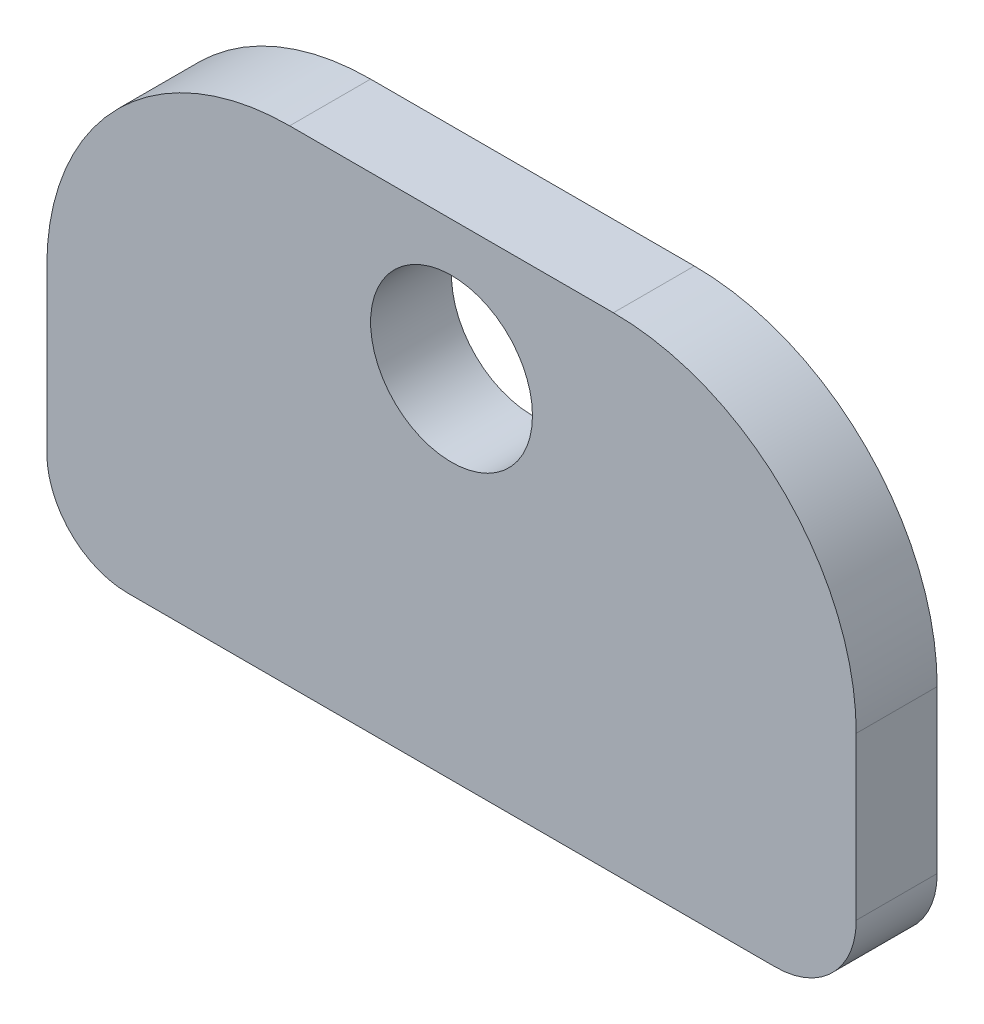
ISO-10303-21;
HEADER;
FILE_DESCRIPTION(('STEP AP214'),'2;1');
FILE_NAME('part.step','',(''),(''),'','','');
FILE_SCHEMA(('AUTOMOTIVE_DESIGN { 1 0 10303 214 1 1 1 1 }'));
ENDSEC;
DATA;
#1=APPLICATION_CONTEXT('core data for automotive mechanical design processes');
#2=APPLICATION_PROTOCOL_DEFINITION('international standard','automotive_design',2000,#1);
#3=PRODUCT_CONTEXT('',#1,'mechanical');
#4=PRODUCT('Part','Part','',(#3));
#5=PRODUCT_RELATED_PRODUCT_CATEGORY('part','',(#4));
#6=PRODUCT_DEFINITION_FORMATION('','',#4);
#7=PRODUCT_DEFINITION_CONTEXT('part definition',#1,'design');
#8=PRODUCT_DEFINITION('design','',#6,#7);
#9=PRODUCT_DEFINITION_SHAPE('','',#8);
#10=(LENGTH_UNIT() NAMED_UNIT(*) SI_UNIT(.MILLI.,.METRE.));
#11=(NAMED_UNIT(*) PLANE_ANGLE_UNIT() SI_UNIT($,.RADIAN.));
#12=(NAMED_UNIT(*) SI_UNIT($,.STERADIAN.) SOLID_ANGLE_UNIT());
#13=UNCERTAINTY_MEASURE_WITH_UNIT(LENGTH_MEASURE(1.E-05),#10,'distance_accuracy_value','');
#14=(GEOMETRIC_REPRESENTATION_CONTEXT(3) GLOBAL_UNCERTAINTY_ASSIGNED_CONTEXT((#13)) GLOBAL_UNIT_ASSIGNED_CONTEXT((#10,
#11,#12)) REPRESENTATION_CONTEXT('',''));
#15=CARTESIAN_POINT('',(0.,0.,0.));
#16=DIRECTION('',(0.,0.,1.));
#17=DIRECTION('',(1.,0.,0.));
#18=AXIS2_PLACEMENT_3D('',#15,#16,#17);
#19=CARTESIAN_POINT('',(20.,-10.,5.));
#20=DIRECTION('',(0.,0.,1.));
#21=DIRECTION('',(1.,0.,0.));
#22=AXIS2_PLACEMENT_3D('',#19,#20,#21);
#23=PLANE('',#22);
#24=CARTESIAN_POINT('',(20.,-10.,5.));
#25=DIRECTION('',(0.,0.,1.));
#26=DIRECTION('',(1.,0.,0.));
#27=AXIS2_PLACEMENT_3D('',#24,#25,#26);
#28=CIRCLE('',#27,5.);
#29=CARTESIAN_POINT('',(20.,-15.,5.));
#30=VERTEX_POINT('',#29);
#31=CARTESIAN_POINT('',(25.,-9.99999999999997,5.));
#32=VERTEX_POINT('',#31);
#33=EDGE_CURVE('E145',#30,#32,#28,.T.);
#34=ORIENTED_EDGE('',*,*,#33,.T.);
#35=DIRECTION('',(0.,1.,0.));
#36=VECTOR('',#35,1.);
#37=CARTESIAN_POINT('',(25.,-9.99999999999997,5.));
#38=LINE('',#37,#36);
#39=CARTESIAN_POINT('',(25.,-1.04744440165294E-13,5.));
#40=VERTEX_POINT('',#39);
#41=EDGE_CURVE('E93',#32,#40,#38,.T.);
#42=ORIENTED_EDGE('',*,*,#41,.T.);
#43=CARTESIAN_POINT('',(10.,0.,5.));
#44=DIRECTION('',(0.,0.,1.));
#45=DIRECTION('',(-1.,0.,0.));
#46=AXIS2_PLACEMENT_3D('',#43,#44,#45);
#47=CIRCLE('',#46,15.);
#48=CARTESIAN_POINT('',(9.9999999999999,15.,5.));
#49=VERTEX_POINT('',#48);
#50=EDGE_CURVE('E160',#40,#49,#47,.T.);
#51=ORIENTED_EDGE('',*,*,#50,.T.);
#52=DIRECTION('',(-1.,0.,0.));
#53=VECTOR('',#52,1.);
#54=CARTESIAN_POINT('',(-9.99999999999989,15.,5.));
#55=LINE('',#54,#53);
#56=CARTESIAN_POINT('',(-9.9999999999999,15.,5.));
#57=VERTEX_POINT('',#56);
#58=EDGE_CURVE('E173',#49,#57,#55,.T.);
#59=ORIENTED_EDGE('',*,*,#58,.T.);
#60=CARTESIAN_POINT('',(-10.,0.,5.));
#61=DIRECTION('',(0.,0.,1.));
#62=DIRECTION('',(-1.,0.,0.));
#63=AXIS2_PLACEMENT_3D('',#60,#61,#62);
#64=CIRCLE('',#63,15.);
#65=CARTESIAN_POINT('',(-25.,-1.07552855510562E-13,5.));
#66=VERTEX_POINT('',#65);
#67=EDGE_CURVE('E112',#57,#66,#64,.T.);
#68=ORIENTED_EDGE('',*,*,#67,.T.);
#69=DIRECTION('',(0.,-1.,0.));
#70=VECTOR('',#69,1.);
#71=CARTESIAN_POINT('',(-25.,-9.99999999999997,5.));
#72=LINE('',#71,#70);
#73=CARTESIAN_POINT('',(-25.,-9.99999999999997,5.));
#74=VERTEX_POINT('',#73);
#75=EDGE_CURVE('E106',#66,#74,#72,.T.);
#76=ORIENTED_EDGE('',*,*,#75,.T.);
#77=CARTESIAN_POINT('',(-20.,-10.,5.));
#78=DIRECTION('',(0.,0.,1.));
#79=DIRECTION('',(1.,0.,0.));
#80=AXIS2_PLACEMENT_3D('',#77,#78,#79);
#81=CIRCLE('',#80,5.);
#82=CARTESIAN_POINT('',(-20.,-15.,5.));
#83=VERTEX_POINT('',#82);
#84=EDGE_CURVE('E110',#74,#83,#81,.T.);
#85=ORIENTED_EDGE('',*,*,#84,.T.);
#86=DIRECTION('',(1.,0.,0.));
#87=VECTOR('',#86,1.);
#88=CARTESIAN_POINT('',(-20.,-15.,5.));
#89=LINE('',#88,#87);
#90=EDGE_CURVE('E50',#83,#30,#89,.T.);
#91=ORIENTED_EDGE('',*,*,#90,.T.);
#92=EDGE_LOOP('',(#34,#42,#51,#59,#68,#76,#85,#91));
#93=FACE_BOUND('',#92,.T.);
#94=CARTESIAN_POINT('',(0.,7.,5.));
#95=DIRECTION('',(0.,0.,1.));
#96=DIRECTION('',(1.,0.,0.));
#97=AXIS2_PLACEMENT_3D('',#94,#95,#96);
#98=CIRCLE('',#97,5.);
#99=CARTESIAN_POINT('',(5.,7.,5.));
#100=VERTEX_POINT('',#99);
#101=EDGE_CURVE('E134',#100,#100,#98,.T.);
#102=ORIENTED_EDGE('',*,*,#101,.F.);
#103=EDGE_LOOP('',(#102));
#104=FACE_BOUND('',#103,.T.);
#105=ADVANCED_FACE('F33',(#93,#104),#23,.T.);
#106=CARTESIAN_POINT('',(20.,-10.,0.));
#107=DIRECTION('',(0.,0.,1.));
#108=DIRECTION('',(1.,0.,0.));
#109=AXIS2_PLACEMENT_3D('',#106,#107,#108);
#110=PLANE('',#109);
#111=CARTESIAN_POINT('',(20.,-10.,0.));
#112=DIRECTION('',(0.,0.,1.));
#113=DIRECTION('',(1.,0.,0.));
#114=AXIS2_PLACEMENT_3D('',#111,#112,#113);
#115=CIRCLE('',#114,5.);
#116=CARTESIAN_POINT('',(20.,-15.,0.));
#117=VERTEX_POINT('',#116);
#118=CARTESIAN_POINT('',(25.,-9.99999999999997,0.));
#119=VERTEX_POINT('',#118);
#120=EDGE_CURVE('E130',#117,#119,#115,.T.);
#121=ORIENTED_EDGE('',*,*,#120,.F.);
#122=DIRECTION('',(1.,0.,0.));
#123=VECTOR('',#122,1.);
#124=CARTESIAN_POINT('',(-20.,-15.,0.));
#125=LINE('',#124,#123);
#126=CARTESIAN_POINT('',(-20.,-15.,0.));
#127=VERTEX_POINT('',#126);
#128=EDGE_CURVE('E85',#127,#117,#125,.T.);
#129=ORIENTED_EDGE('',*,*,#128,.F.);
#130=CARTESIAN_POINT('',(-20.,-10.,0.));
#131=DIRECTION('',(0.,0.,1.));
#132=DIRECTION('',(1.,0.,0.));
#133=AXIS2_PLACEMENT_3D('',#130,#131,#132);
#134=CIRCLE('',#133,5.);
#135=CARTESIAN_POINT('',(-25.,-9.99999999999997,0.));
#136=VERTEX_POINT('',#135);
#137=EDGE_CURVE('E79',#136,#127,#134,.T.);
#138=ORIENTED_EDGE('',*,*,#137,.F.);
#139=DIRECTION('',(0.,-1.,0.));
#140=VECTOR('',#139,1.);
#141=CARTESIAN_POINT('',(-25.,-9.99999999999997,0.));
#142=LINE('',#141,#140);
#143=CARTESIAN_POINT('',(-25.,-1.07552855510562E-13,0.));
#144=VERTEX_POINT('',#143);
#145=EDGE_CURVE('E120',#144,#136,#142,.T.);
#146=ORIENTED_EDGE('',*,*,#145,.F.);
#147=CARTESIAN_POINT('',(-10.,0.,0.));
#148=DIRECTION('',(0.,0.,1.));
#149=DIRECTION('',(-1.,0.,0.));
#150=AXIS2_PLACEMENT_3D('',#147,#148,#149);
#151=CIRCLE('',#150,15.);
#152=CARTESIAN_POINT('',(-9.9999999999999,15.,0.));
#153=VERTEX_POINT('',#152);
#154=EDGE_CURVE('E140',#153,#144,#151,.T.);
#155=ORIENTED_EDGE('',*,*,#154,.F.);
#156=DIRECTION('',(-1.,0.,0.));
#157=VECTOR('',#156,1.);
#158=CARTESIAN_POINT('',(-9.99999999999989,15.,0.));
#159=LINE('',#158,#157);
#160=CARTESIAN_POINT('',(9.9999999999999,15.,0.));
#161=VERTEX_POINT('',#160);
#162=EDGE_CURVE('E138',#161,#153,#159,.T.);
#163=ORIENTED_EDGE('',*,*,#162,.F.);
#164=CARTESIAN_POINT('',(10.,0.,0.));
#165=DIRECTION('',(0.,0.,1.));
#166=DIRECTION('',(-1.,0.,0.));
#167=AXIS2_PLACEMENT_3D('',#164,#165,#166);
#168=CIRCLE('',#167,15.);
#169=CARTESIAN_POINT('',(25.,-1.04744440165294E-13,0.));
#170=VERTEX_POINT('',#169);
#171=EDGE_CURVE('E136',#170,#161,#168,.T.);
#172=ORIENTED_EDGE('',*,*,#171,.F.);
#173=DIRECTION('',(0.,1.,0.));
#174=VECTOR('',#173,1.);
#175=CARTESIAN_POINT('',(25.,-9.99999999999997,0.));
#176=LINE('',#175,#174);
#177=EDGE_CURVE('E133',#119,#170,#176,.T.);
#178=ORIENTED_EDGE('',*,*,#177,.F.);
#179=EDGE_LOOP('',(#121,#129,#138,#146,#155,#163,#172,#178));
#180=FACE_BOUND('',#179,.T.);
#181=CARTESIAN_POINT('',(0.,7.,0.));
#182=DIRECTION('',(0.,0.,1.));
#183=DIRECTION('',(1.,0.,0.));
#184=AXIS2_PLACEMENT_3D('',#181,#182,#183);
#185=CIRCLE('',#184,5.);
#186=CARTESIAN_POINT('',(5.,7.,0.));
#187=VERTEX_POINT('',#186);
#188=EDGE_CURVE('E179',#187,#187,#185,.T.);
#189=ORIENTED_EDGE('',*,*,#188,.T.);
#190=EDGE_LOOP('',(#189));
#191=FACE_BOUND('',#190,.T.);
#192=ADVANCED_FACE('F164',(#180,#191),#110,.F.);
#193=CARTESIAN_POINT('',(20.,-10.,5.));
#194=DIRECTION('',(0.,0.,-1.));
#195=DIRECTION('',(-1.,0.,0.));
#196=AXIS2_PLACEMENT_3D('',#193,#194,#195);
#197=CYLINDRICAL_SURFACE('',#196,5.);
#198=ORIENTED_EDGE('',*,*,#120,.T.);
#199=DIRECTION('',(0.,0.,-1.));
#200=VECTOR('',#199,1.);
#201=CARTESIAN_POINT('',(25.,-9.99999999999997,5.));
#202=LINE('',#201,#200);
#203=EDGE_CURVE('E11',#32,#119,#202,.T.);
#204=ORIENTED_EDGE('',*,*,#203,.F.);
#205=ORIENTED_EDGE('',*,*,#33,.F.);
#206=DIRECTION('',(0.,0.,-1.));
#207=VECTOR('',#206,1.);
#208=CARTESIAN_POINT('',(20.,-15.,5.));
#209=LINE('',#208,#207);
#210=EDGE_CURVE('E126',#30,#117,#209,.T.);
#211=ORIENTED_EDGE('',*,*,#210,.T.);
#212=EDGE_LOOP('',(#198,#204,#205,#211));
#213=FACE_BOUND('',#212,.T.);
#214=ADVANCED_FACE('F35',(#213),#197,.T.);
#215=CARTESIAN_POINT('',(25.,-9.99999999999997,5.));
#216=DIRECTION('',(-1.,0.,0.));
#217=DIRECTION('',(0.,0.,1.));
#218=AXIS2_PLACEMENT_3D('',#215,#216,#217);
#219=PLANE('',#218);
#220=ORIENTED_EDGE('',*,*,#177,.T.);
#221=DIRECTION('',(0.,0.,-1.));
#222=VECTOR('',#221,1.);
#223=CARTESIAN_POINT('',(25.,-1.04744440165294E-13,5.));
#224=LINE('',#223,#222);
#225=EDGE_CURVE('E42',#40,#170,#224,.T.);
#226=ORIENTED_EDGE('',*,*,#225,.F.);
#227=ORIENTED_EDGE('',*,*,#41,.F.);
#228=ORIENTED_EDGE('',*,*,#203,.T.);
#229=EDGE_LOOP('',(#220,#226,#227,#228));
#230=FACE_BOUND('',#229,.T.);
#231=ADVANCED_FACE('F207',(#230),#219,.F.);
#232=CARTESIAN_POINT('',(10.,0.,5.));
#233=DIRECTION('',(0.,0.,-1.));
#234=DIRECTION('',(-1.,0.,0.));
#235=AXIS2_PLACEMENT_3D('',#232,#233,#234);
#236=CYLINDRICAL_SURFACE('',#235,15.);
#237=ORIENTED_EDGE('',*,*,#171,.T.);
#238=DIRECTION('',(0.,0.,-1.));
#239=VECTOR('',#238,1.);
#240=CARTESIAN_POINT('',(9.9999999999999,15.,5.));
#241=LINE('',#240,#239);
#242=EDGE_CURVE('E152',#49,#161,#241,.T.);
#243=ORIENTED_EDGE('',*,*,#242,.F.);
#244=ORIENTED_EDGE('',*,*,#50,.F.);
#245=ORIENTED_EDGE('',*,*,#225,.T.);
#246=EDGE_LOOP('',(#237,#243,#244,#245));
#247=FACE_BOUND('',#246,.T.);
#248=ADVANCED_FACE('F158',(#247),#236,.T.);
#249=CARTESIAN_POINT('',(-9.99999999999989,15.,5.));
#250=DIRECTION('',(0.,-1.,0.));
#251=DIRECTION('',(0.,0.,-1.));
#252=AXIS2_PLACEMENT_3D('',#249,#250,#251);
#253=PLANE('',#252);
#254=ORIENTED_EDGE('',*,*,#162,.T.);
#255=DIRECTION('',(0.,0.,-1.));
#256=VECTOR('',#255,1.);
#257=CARTESIAN_POINT('',(-9.9999999999999,15.,5.));
#258=LINE('',#257,#256);
#259=EDGE_CURVE('E149',#57,#153,#258,.T.);
#260=ORIENTED_EDGE('',*,*,#259,.F.);
#261=ORIENTED_EDGE('',*,*,#58,.F.);
#262=ORIENTED_EDGE('',*,*,#242,.T.);
#263=EDGE_LOOP('',(#254,#260,#261,#262));
#264=FACE_BOUND('',#263,.T.);
#265=ADVANCED_FACE('F169',(#264),#253,.F.);
#266=CARTESIAN_POINT('',(-10.,0.,5.));
#267=DIRECTION('',(0.,0.,-1.));
#268=DIRECTION('',(-1.,0.,0.));
#269=AXIS2_PLACEMENT_3D('',#266,#267,#268);
#270=CYLINDRICAL_SURFACE('',#269,15.);
#271=ORIENTED_EDGE('',*,*,#154,.T.);
#272=DIRECTION('',(0.,0.,-1.));
#273=VECTOR('',#272,1.);
#274=CARTESIAN_POINT('',(-25.,-1.07552855510562E-13,5.));
#275=LINE('',#274,#273);
#276=EDGE_CURVE('E121',#66,#144,#275,.T.);
#277=ORIENTED_EDGE('',*,*,#276,.F.);
#278=ORIENTED_EDGE('',*,*,#67,.F.);
#279=ORIENTED_EDGE('',*,*,#259,.T.);
#280=EDGE_LOOP('',(#271,#277,#278,#279));
#281=FACE_BOUND('',#280,.T.);
#282=ADVANCED_FACE('F172',(#281),#270,.T.);
#283=CARTESIAN_POINT('',(-25.,-9.99999999999997,5.));
#284=DIRECTION('',(1.,0.,0.));
#285=DIRECTION('',(0.,0.,-1.));
#286=AXIS2_PLACEMENT_3D('',#283,#284,#285);
#287=PLANE('',#286);
#288=ORIENTED_EDGE('',*,*,#145,.T.);
#289=DIRECTION('',(0.,0.,-1.));
#290=VECTOR('',#289,1.);
#291=CARTESIAN_POINT('',(-25.,-9.99999999999997,5.));
#292=LINE('',#291,#290);
#293=EDGE_CURVE('E117',#74,#136,#292,.T.);
#294=ORIENTED_EDGE('',*,*,#293,.F.);
#295=ORIENTED_EDGE('',*,*,#75,.F.);
#296=ORIENTED_EDGE('',*,*,#276,.T.);
#297=EDGE_LOOP('',(#288,#294,#295,#296));
#298=FACE_BOUND('',#297,.T.);
#299=ADVANCED_FACE('F118',(#298),#287,.F.);
#300=CARTESIAN_POINT('',(-20.,-10.,5.));
#301=DIRECTION('',(0.,0.,-1.));
#302=DIRECTION('',(-1.,0.,0.));
#303=AXIS2_PLACEMENT_3D('',#300,#301,#302);
#304=CYLINDRICAL_SURFACE('',#303,5.);
#305=ORIENTED_EDGE('',*,*,#137,.T.);
#306=DIRECTION('',(0.,0.,-1.));
#307=VECTOR('',#306,1.);
#308=CARTESIAN_POINT('',(-20.,-15.,5.));
#309=LINE('',#308,#307);
#310=EDGE_CURVE('E122',#83,#127,#309,.T.);
#311=ORIENTED_EDGE('',*,*,#310,.F.);
#312=ORIENTED_EDGE('',*,*,#84,.F.);
#313=ORIENTED_EDGE('',*,*,#293,.T.);
#314=EDGE_LOOP('',(#305,#311,#312,#313));
#315=FACE_BOUND('',#314,.T.);
#316=ADVANCED_FACE('F124',(#315),#304,.T.);
#317=CARTESIAN_POINT('',(-20.,-15.,5.));
#318=DIRECTION('',(0.,1.,0.));
#319=DIRECTION('',(0.,0.,1.));
#320=AXIS2_PLACEMENT_3D('',#317,#318,#319);
#321=PLANE('',#320);
#322=ORIENTED_EDGE('',*,*,#128,.T.);
#323=ORIENTED_EDGE('',*,*,#210,.F.);
#324=ORIENTED_EDGE('',*,*,#90,.F.);
#325=ORIENTED_EDGE('',*,*,#310,.T.);
#326=EDGE_LOOP('',(#322,#323,#324,#325));
#327=FACE_BOUND('',#326,.T.);
#328=ADVANCED_FACE('F195',(#327),#321,.F.);
#329=CARTESIAN_POINT('',(0.,7.,5.));
#330=DIRECTION('',(0.,0.,-1.));
#331=DIRECTION('',(-1.,0.,0.));
#332=AXIS2_PLACEMENT_3D('',#329,#330,#331);
#333=CYLINDRICAL_SURFACE('',#332,5.);
#334=ORIENTED_EDGE('',*,*,#101,.T.);
#335=EDGE_LOOP('',(#334));
#336=FACE_BOUND('',#335,.T.);
#337=ORIENTED_EDGE('',*,*,#188,.F.);
#338=EDGE_LOOP('',(#337));
#339=FACE_BOUND('',#338,.T.);
#340=ADVANCED_FACE('F185',(#336,#339),#333,.F.);
#341=CLOSED_SHELL('',(#105,#192,#214,#231,#248,#265,#282,#299,#316,#328,#340));
#342=MANIFOLD_SOLID_BREP('B2',#341);
#343=ADVANCED_BREP_SHAPE_REPRESENTATION('',(#18,#342),#14);
#344=SHAPE_DEFINITION_REPRESENTATION(#9,#343);
ENDSEC;
END-ISO-10303-21;
